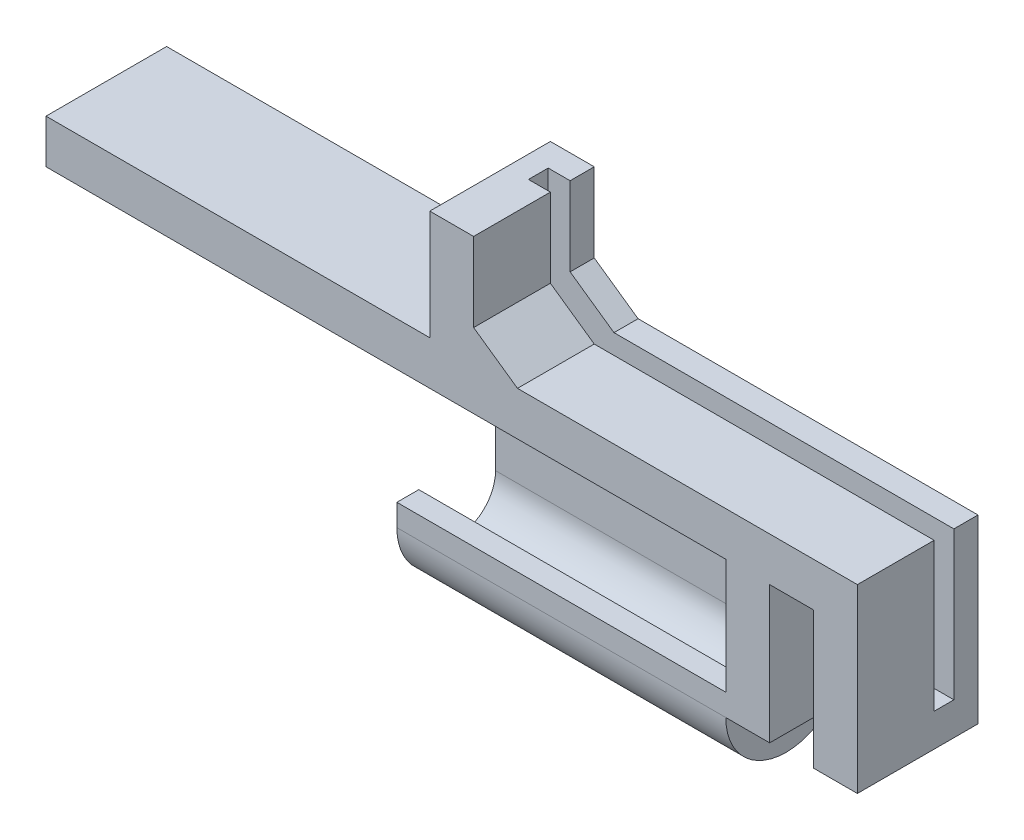
ISO-10303-21;
HEADER;
FILE_DESCRIPTION(('STEP AP214'),'2;1');
FILE_NAME('part.step','',(''),(''),'','','');
FILE_SCHEMA(('AUTOMOTIVE_DESIGN { 1 0 10303 214 1 1 1 1 }'));
ENDSEC;
DATA;
#1=APPLICATION_CONTEXT('core data for automotive mechanical design processes');
#2=APPLICATION_PROTOCOL_DEFINITION('international standard','automotive_design',2000,#1);
#3=PRODUCT_CONTEXT('',#1,'mechanical');
#4=PRODUCT('Part','Part','',(#3));
#5=PRODUCT_RELATED_PRODUCT_CATEGORY('part','',(#4));
#6=PRODUCT_DEFINITION_FORMATION('','',#4);
#7=PRODUCT_DEFINITION_CONTEXT('part definition',#1,'design');
#8=PRODUCT_DEFINITION('design','',#6,#7);
#9=PRODUCT_DEFINITION_SHAPE('','',#8);
#10=(LENGTH_UNIT() NAMED_UNIT(*) SI_UNIT(.MILLI.,.METRE.));
#11=(NAMED_UNIT(*) PLANE_ANGLE_UNIT() SI_UNIT($,.RADIAN.));
#12=(NAMED_UNIT(*) SI_UNIT($,.STERADIAN.) SOLID_ANGLE_UNIT());
#13=UNCERTAINTY_MEASURE_WITH_UNIT(LENGTH_MEASURE(1.E-05),#10,'distance_accuracy_value','');
#14=(GEOMETRIC_REPRESENTATION_CONTEXT(3) GLOBAL_UNCERTAINTY_ASSIGNED_CONTEXT((#13)) GLOBAL_UNIT_ASSIGNED_CONTEXT((#10,
#11,#12)) REPRESENTATION_CONTEXT('',''));
#15=CARTESIAN_POINT('',(0.,0.,0.));
#16=DIRECTION('',(0.,0.,1.));
#17=DIRECTION('',(1.,0.,0.));
#18=AXIS2_PLACEMENT_3D('',#15,#16,#17);
#19=CARTESIAN_POINT('',(37.,8.25,0.));
#20=DIRECTION('',(0.,-1.,0.));
#21=DIRECTION('',(0.,0.,-1.));
#22=AXIS2_PLACEMENT_3D('',#19,#20,#21);
#23=PLANE('',#22);
#24=DIRECTION('',(-1.,0.,0.));
#25=VECTOR('',#24,1.);
#26=CARTESIAN_POINT('',(37.,8.25,-5.5));
#27=LINE('',#26,#25);
#28=CARTESIAN_POINT('',(37.,8.25,-5.5));
#29=VERTEX_POINT('',#28);
#30=CARTESIAN_POINT('',(21.5,8.25,-5.5));
#31=VERTEX_POINT('',#30);
#32=EDGE_CURVE('E557',#29,#31,#27,.T.);
#33=ORIENTED_EDGE('',*,*,#32,.T.);
#34=DIRECTION('',(0.,0.,1.));
#35=VECTOR('',#34,1.);
#36=CARTESIAN_POINT('',(21.5,8.25,-4.4));
#37=LINE('',#36,#35);
#38=CARTESIAN_POINT('',(21.5,8.25,-4.4));
#39=VERTEX_POINT('',#38);
#40=EDGE_CURVE('E577',#31,#39,#37,.T.);
#41=ORIENTED_EDGE('',*,*,#40,.T.);
#42=DIRECTION('',(1.,0.,0.));
#43=VECTOR('',#42,1.);
#44=CARTESIAN_POINT('',(37.,8.25,-4.4));
#45=LINE('',#44,#43);
#46=CARTESIAN_POINT('',(37.,8.25,-4.4));
#47=VERTEX_POINT('',#46);
#48=EDGE_CURVE('E307',#39,#47,#45,.T.);
#49=ORIENTED_EDGE('',*,*,#48,.T.);
#50=DIRECTION('',(0.,0.,1.));
#51=VECTOR('',#50,1.);
#52=CARTESIAN_POINT('',(37.,8.25,0.));
#53=LINE('',#52,#51);
#54=EDGE_CURVE('E617',#29,#47,#53,.T.);
#55=ORIENTED_EDGE('',*,*,#54,.F.);
#56=EDGE_LOOP('',(#33,#41,#49,#55));
#57=FACE_BOUND('',#56,.T.);
#58=ADVANCED_FACE('F35',(#57),#23,.F.);
#59=CARTESIAN_POINT('',(37.,6.25,0.));
#60=DIRECTION('',(0.,1.,0.));
#61=DIRECTION('',(0.,0.,1.));
#62=AXIS2_PLACEMENT_3D('',#59,#60,#61);
#63=PLANE('',#62);
#64=DIRECTION('',(0.,0.,-1.));
#65=VECTOR('',#64,1.);
#66=CARTESIAN_POINT('',(35.,6.25,0.));
#67=LINE('',#66,#65);
#68=CARTESIAN_POINT('',(35.,6.25,-4.4));
#69=VERTEX_POINT('',#68);
#70=CARTESIAN_POINT('',(35.,6.25,-5.5));
#71=VERTEX_POINT('',#70);
#72=EDGE_CURVE('E380',#69,#71,#67,.T.);
#73=ORIENTED_EDGE('',*,*,#72,.F.);
#74=DIRECTION('',(-1.,0.,0.));
#75=VECTOR('',#74,1.);
#76=CARTESIAN_POINT('',(37.,6.25,-4.4));
#77=LINE('',#76,#75);
#78=CARTESIAN_POINT('',(33.,6.25,-4.4));
#79=VERTEX_POINT('',#78);
#80=EDGE_CURVE('E311',#69,#79,#77,.T.);
#81=ORIENTED_EDGE('',*,*,#80,.T.);
#82=DIRECTION('',(0.,0.,-1.));
#83=VECTOR('',#82,1.);
#84=CARTESIAN_POINT('',(33.,6.25,0.));
#85=LINE('',#84,#83);
#86=CARTESIAN_POINT('',(33.,6.25,-5.5));
#87=VERTEX_POINT('',#86);
#88=EDGE_CURVE('E454',#79,#87,#85,.T.);
#89=ORIENTED_EDGE('',*,*,#88,.T.);
#90=DIRECTION('',(-1.,0.,0.));
#91=VECTOR('',#90,1.);
#92=CARTESIAN_POINT('',(37.,6.25,-5.5));
#93=LINE('',#92,#91);
#94=EDGE_CURVE('E370',#71,#87,#93,.T.);
#95=ORIENTED_EDGE('',*,*,#94,.F.);
#96=EDGE_LOOP('',(#73,#81,#89,#95));
#97=FACE_BOUND('',#96,.T.);
#98=ADVANCED_FACE('F613',(#97),#63,.F.);
#99=CARTESIAN_POINT('',(19.5,13.25,0.));
#100=DIRECTION('',(-1.,0.,0.));
#101=DIRECTION('',(0.,0.,1.));
#102=AXIS2_PLACEMENT_3D('',#99,#100,#101);
#103=PLANE('',#102);
#104=DIRECTION('',(0.,-1.,0.));
#105=VECTOR('',#104,1.);
#106=CARTESIAN_POINT('',(19.5,13.25,-4.4));
#107=LINE('',#106,#105);
#108=CARTESIAN_POINT('',(19.5,13.25,-4.4));
#109=VERTEX_POINT('',#108);
#110=CARTESIAN_POINT('',(19.5,9.65041507641942,-4.4));
#111=VERTEX_POINT('',#110);
#112=EDGE_CURVE('E304',#109,#111,#107,.T.);
#113=ORIENTED_EDGE('',*,*,#112,.T.);
#114=DIRECTION('',(0.,0.,-1.));
#115=VECTOR('',#114,1.);
#116=CARTESIAN_POINT('',(19.5,9.65041507641942,-5.5));
#117=LINE('',#116,#115);
#118=CARTESIAN_POINT('',(19.5,9.65041507641942,-5.5));
#119=VERTEX_POINT('',#118);
#120=EDGE_CURVE('E581',#111,#119,#117,.T.);
#121=ORIENTED_EDGE('',*,*,#120,.T.);
#122=DIRECTION('',(0.,-1.,0.));
#123=VECTOR('',#122,1.);
#124=CARTESIAN_POINT('',(19.5,13.25,-5.5));
#125=LINE('',#124,#123);
#126=CARTESIAN_POINT('',(19.5,13.25,-5.5));
#127=VERTEX_POINT('',#126);
#128=EDGE_CURVE('E355',#127,#119,#125,.T.);
#129=ORIENTED_EDGE('',*,*,#128,.F.);
#130=DIRECTION('',(0.,0.,-1.));
#131=VECTOR('',#130,1.);
#132=CARTESIAN_POINT('',(19.5,13.25,0.));
#133=LINE('',#132,#131);
#134=EDGE_CURVE('E329',#109,#127,#133,.T.);
#135=ORIENTED_EDGE('',*,*,#134,.F.);
#136=EDGE_LOOP('',(#113,#121,#129,#135));
#137=FACE_BOUND('',#136,.T.);
#138=ADVANCED_FACE('F597',(#137),#103,.F.);
#139=DIRECTION('',(-1.,0.,0.));
#140=VECTOR('',#139,1.);
#141=CARTESIAN_POINT('',(37.,8.25,-3.5));
#142=LINE('',#141,#140);
#143=CARTESIAN_POINT('',(37.,8.25,-3.5));
#144=VERTEX_POINT('',#143);
#145=CARTESIAN_POINT('',(21.5,8.25,-3.5));
#146=VERTEX_POINT('',#145);
#147=EDGE_CURVE('E272',#144,#146,#142,.T.);
#148=ORIENTED_EDGE('',*,*,#147,.T.);
#149=DIRECTION('',(0.,0.,1.));
#150=VECTOR('',#149,1.);
#151=CARTESIAN_POINT('',(21.5,8.25,0.));
#152=LINE('',#151,#150);
#153=CARTESIAN_POINT('',(21.5,8.25,0.));
#154=VERTEX_POINT('',#153);
#155=EDGE_CURVE('E50',#146,#154,#152,.T.);
#156=ORIENTED_EDGE('',*,*,#155,.T.);
#157=DIRECTION('',(-1.,0.,0.));
#158=VECTOR('',#157,1.);
#159=CARTESIAN_POINT('',(37.,8.25,0.));
#160=LINE('',#159,#158);
#161=CARTESIAN_POINT('',(37.,8.25,0.));
#162=VERTEX_POINT('',#161);
#163=EDGE_CURVE('E562',#162,#154,#160,.T.);
#164=ORIENTED_EDGE('',*,*,#163,.F.);
#165=EDGE_CURVE('E620',#144,#162,#53,.T.);
#166=ORIENTED_EDGE('',*,*,#165,.F.);
#167=EDGE_LOOP('',(#148,#156,#164,#166));
#168=FACE_BOUND('',#167,.T.);
#169=ADVANCED_FACE('F669',(#168),#23,.F.);
#170=DIRECTION('',(0.,0.,1.));
#171=VECTOR('',#170,1.);
#172=CARTESIAN_POINT('',(17.5,8.25,-5.5));
#173=LINE('',#172,#171);
#174=CARTESIAN_POINT('',(17.5,8.25,-5.5));
#175=VERTEX_POINT('',#174);
#176=CARTESIAN_POINT('',(17.5,8.25,0.));
#177=VERTEX_POINT('',#176);
#178=EDGE_CURVE('E324',#175,#177,#173,.T.);
#179=ORIENTED_EDGE('',*,*,#178,.F.);
#180=CARTESIAN_POINT('',(0.,8.25,-5.5));
#181=VERTEX_POINT('',#180);
#182=EDGE_CURVE('E344',#175,#181,#27,.T.);
#183=ORIENTED_EDGE('',*,*,#182,.T.);
#184=DIRECTION('',(0.,0.,1.));
#185=VECTOR('',#184,1.);
#186=CARTESIAN_POINT('',(0.,8.25,0.));
#187=LINE('',#186,#185);
#188=CARTESIAN_POINT('',(0.,8.25,0.));
#189=VERTEX_POINT('',#188);
#190=EDGE_CURVE('E629',#181,#189,#187,.T.);
#191=ORIENTED_EDGE('',*,*,#190,.T.);
#192=EDGE_CURVE('E422',#177,#189,#160,.T.);
#193=ORIENTED_EDGE('',*,*,#192,.F.);
#194=EDGE_LOOP('',(#179,#183,#191,#193));
#195=FACE_BOUND('',#194,.T.);
#196=ADVANCED_FACE('F667',(#195),#23,.F.);
#197=CARTESIAN_POINT('',(31.,0.,0.));
#198=DIRECTION('',(1.,0.,0.));
#199=DIRECTION('',(0.,0.,-1.));
#200=AXIS2_PLACEMENT_3D('',#197,#198,#199);
#201=PLANE('',#200);
#202=DIRECTION('',(0.,0.,-1.));
#203=VECTOR('',#202,1.);
#204=CARTESIAN_POINT('',(31.,0.099584923580582,0.));
#205=LINE('',#204,#203);
#206=CARTESIAN_POINT('',(31.,0.099584923580582,-3.5));
#207=VERTEX_POINT('',#206);
#208=CARTESIAN_POINT('',(31.,0.099584923580582,-4.4));
#209=VERTEX_POINT('',#208);
#210=EDGE_CURVE('E379',#207,#209,#205,.T.);
#211=ORIENTED_EDGE('',*,*,#210,.T.);
#212=DIRECTION('',(0.,1.,0.));
#213=VECTOR('',#212,1.);
#214=CARTESIAN_POINT('',(31.,0.,-4.4));
#215=LINE('',#214,#213);
#216=CARTESIAN_POINT('',(31.,6.25,-4.4));
#217=VERTEX_POINT('',#216);
#218=EDGE_CURVE('E320',#209,#217,#215,.T.);
#219=ORIENTED_EDGE('',*,*,#218,.T.);
#220=DIRECTION('',(0.,0.,-1.));
#221=VECTOR('',#220,1.);
#222=CARTESIAN_POINT('',(31.,6.25,0.));
#223=LINE('',#222,#221);
#224=CARTESIAN_POINT('',(31.,6.25,-4.5));
#225=VERTEX_POINT('',#224);
#226=EDGE_CURVE('E446',#217,#225,#223,.T.);
#227=ORIENTED_EDGE('',*,*,#226,.T.);
#228=DIRECTION('',(0.,1.,0.));
#229=VECTOR('',#228,1.);
#230=CARTESIAN_POINT('',(31.,0.,-4.5));
#231=LINE('',#230,#229);
#232=CARTESIAN_POINT('',(31.,0.,-4.5));
#233=VERTEX_POINT('',#232);
#234=EDGE_CURVE('E338',#233,#225,#231,.T.);
#235=ORIENTED_EDGE('',*,*,#234,.F.);
#236=DIRECTION('',(0.,0.,-1.));
#237=VECTOR('',#236,1.);
#238=CARTESIAN_POINT('',(31.,0.,0.));
#239=LINE('',#238,#237);
#240=CARTESIAN_POINT('',(31.,0.,-1.));
#241=VERTEX_POINT('',#240);
#242=EDGE_CURVE('E439',#241,#233,#239,.T.);
#243=ORIENTED_EDGE('',*,*,#242,.F.);
#244=DIRECTION('',(0.,1.,0.));
#245=VECTOR('',#244,1.);
#246=CARTESIAN_POINT('',(31.,0.,-1.));
#247=LINE('',#246,#245);
#248=CARTESIAN_POINT('',(31.,1.,-1.));
#249=VERTEX_POINT('',#248);
#250=EDGE_CURVE('E501',#241,#249,#247,.T.);
#251=ORIENTED_EDGE('',*,*,#250,.T.);
#252=DIRECTION('',(0.,0.,1.));
#253=VECTOR('',#252,1.);
#254=CARTESIAN_POINT('',(31.,1.,0.));
#255=LINE('',#254,#253);
#256=CARTESIAN_POINT('',(31.,1.,0.));
#257=VERTEX_POINT('',#256);
#258=EDGE_CURVE('E498',#249,#257,#255,.T.);
#259=ORIENTED_EDGE('',*,*,#258,.T.);
#260=DIRECTION('',(0.,1.,0.));
#261=VECTOR('',#260,1.);
#262=CARTESIAN_POINT('',(31.,0.,0.));
#263=LINE('',#262,#261);
#264=CARTESIAN_POINT('',(31.,6.25,0.));
#265=VERTEX_POINT('',#264);
#266=EDGE_CURVE('E441',#257,#265,#263,.T.);
#267=ORIENTED_EDGE('',*,*,#266,.T.);
#268=CARTESIAN_POINT('',(31.,6.25,-3.5));
#269=VERTEX_POINT('',#268);
#270=EDGE_CURVE('E443',#265,#269,#223,.T.);
#271=ORIENTED_EDGE('',*,*,#270,.T.);
#272=DIRECTION('',(0.,-1.,0.));
#273=VECTOR('',#272,1.);
#274=CARTESIAN_POINT('',(31.,0.,-3.5));
#275=LINE('',#274,#273);
#276=EDGE_CURVE('E302',#269,#207,#275,.T.);
#277=ORIENTED_EDGE('',*,*,#276,.T.);
#278=EDGE_LOOP('',(#211,#219,#227,#235,#243,#251,#259,#267,#271,#277));
#279=FACE_BOUND('',#278,.T.);
#280=ADVANCED_FACE('F516',(#279),#201,.F.);
#281=ORIENTED_EDGE('',*,*,#226,.F.);
#282=DIRECTION('',(-1.,0.,0.));
#283=VECTOR('',#282,1.);
#284=CARTESIAN_POINT('',(37.,6.25,-4.4));
#285=LINE('',#284,#283);
#286=CARTESIAN_POINT('',(18.5,6.25,-4.4));
#287=VERTEX_POINT('',#286);
#288=EDGE_CURVE('E317',#217,#287,#285,.T.);
#289=ORIENTED_EDGE('',*,*,#288,.T.);
#290=DIRECTION('',(0.,0.,1.));
#291=VECTOR('',#290,1.);
#292=CARTESIAN_POINT('',(18.5,6.25,0.));
#293=LINE('',#292,#291);
#294=CARTESIAN_POINT('',(18.5,6.25,-3.5));
#295=VERTEX_POINT('',#294);
#296=EDGE_CURVE('E285',#287,#295,#293,.T.);
#297=ORIENTED_EDGE('',*,*,#296,.T.);
#298=DIRECTION('',(1.,0.,0.));
#299=VECTOR('',#298,1.);
#300=CARTESIAN_POINT('',(37.,6.25,-3.5));
#301=LINE('',#300,#299);
#302=EDGE_CURVE('E299',#295,#269,#301,.T.);
#303=ORIENTED_EDGE('',*,*,#302,.T.);
#304=ORIENTED_EDGE('',*,*,#270,.F.);
#305=DIRECTION('',(-1.,0.,0.));
#306=VECTOR('',#305,1.);
#307=CARTESIAN_POINT('',(37.,6.25,0.));
#308=LINE('',#307,#306);
#309=CARTESIAN_POINT('',(0.,6.25,0.));
#310=VERTEX_POINT('',#309);
#311=EDGE_CURVE('E405',#265,#310,#308,.T.);
#312=ORIENTED_EDGE('',*,*,#311,.T.);
#313=DIRECTION('',(0.,0.,-1.));
#314=VECTOR('',#313,1.);
#315=CARTESIAN_POINT('',(0.,6.25,0.));
#316=LINE('',#315,#314);
#317=CARTESIAN_POINT('',(0.,6.25,-5.5));
#318=VERTEX_POINT('',#317);
#319=EDGE_CURVE('E554',#310,#318,#316,.T.);
#320=ORIENTED_EDGE('',*,*,#319,.T.);
#321=CARTESIAN_POINT('',(16.,6.25,-5.5));
#322=VERTEX_POINT('',#321);
#323=EDGE_CURVE('E410',#322,#318,#93,.T.);
#324=ORIENTED_EDGE('',*,*,#323,.F.);
#325=DIRECTION('',(0.,0.,-1.));
#326=VECTOR('',#325,1.);
#327=CARTESIAN_POINT('',(16.,6.25,0.));
#328=LINE('',#327,#326);
#329=CARTESIAN_POINT('',(16.,6.25,-4.5));
#330=VERTEX_POINT('',#329);
#331=EDGE_CURVE('E474',#330,#322,#328,.T.);
#332=ORIENTED_EDGE('',*,*,#331,.F.);
#333=DIRECTION('',(-1.,0.,0.));
#334=VECTOR('',#333,1.);
#335=CARTESIAN_POINT('',(31.,6.25,-4.5));
#336=LINE('',#335,#334);
#337=EDGE_CURVE('E470',#225,#330,#336,.T.);
#338=ORIENTED_EDGE('',*,*,#337,.F.);
#339=EDGE_LOOP('',(#281,#289,#297,#303,#304,#312,#320,#324,#332,#338));
#340=FACE_BOUND('',#339,.T.);
#341=ADVANCED_FACE('F551',(#340),#63,.F.);
#342=CARTESIAN_POINT('',(33.,6.25,0.));
#343=VERTEX_POINT('',#342);
#344=CARTESIAN_POINT('',(33.,6.25,-3.5));
#345=VERTEX_POINT('',#344);
#346=EDGE_CURVE('E451',#343,#345,#85,.T.);
#347=ORIENTED_EDGE('',*,*,#346,.T.);
#348=DIRECTION('',(1.,0.,0.));
#349=VECTOR('',#348,1.);
#350=CARTESIAN_POINT('',(37.,6.25,-3.5));
#351=LINE('',#350,#349);
#352=CARTESIAN_POINT('',(35.,6.25,-3.5));
#353=VERTEX_POINT('',#352);
#354=EDGE_CURVE('E294',#345,#353,#351,.T.);
#355=ORIENTED_EDGE('',*,*,#354,.T.);
#356=CARTESIAN_POINT('',(35.,6.25,0.));
#357=VERTEX_POINT('',#356);
#358=EDGE_CURVE('E383',#357,#353,#67,.T.);
#359=ORIENTED_EDGE('',*,*,#358,.F.);
#360=EDGE_CURVE('E408',#357,#343,#308,.T.);
#361=ORIENTED_EDGE('',*,*,#360,.T.);
#362=EDGE_LOOP('',(#347,#355,#359,#361));
#363=FACE_BOUND('',#362,.T.);
#364=ADVANCED_FACE('F642',(#363),#63,.F.);
#365=CARTESIAN_POINT('',(37.,0.,-5.5));
#366=DIRECTION('',(0.,0.,-1.));
#367=DIRECTION('',(-1.,0.,0.));
#368=AXIS2_PLACEMENT_3D('',#365,#366,#367);
#369=PLANE('',#368);
#370=DIRECTION('',(0.,-1.,0.));
#371=VECTOR('',#370,1.);
#372=CARTESIAN_POINT('',(16.,0.,-5.5));
#373=LINE('',#372,#371);
#374=CARTESIAN_POINT('',(16.,0.,-5.5));
#375=VERTEX_POINT('',#374);
#376=EDGE_CURVE('E477',#322,#375,#373,.T.);
#377=ORIENTED_EDGE('',*,*,#376,.F.);
#378=ORIENTED_EDGE('',*,*,#323,.T.);
#379=DIRECTION('',(0.,-1.,0.));
#380=VECTOR('',#379,1.);
#381=CARTESIAN_POINT('',(0.,0.,-5.5));
#382=LINE('',#381,#380);
#383=EDGE_CURVE('E627',#181,#318,#382,.T.);
#384=ORIENTED_EDGE('',*,*,#383,.F.);
#385=ORIENTED_EDGE('',*,*,#182,.F.);
#386=DIRECTION('',(0.,-1.,0.));
#387=VECTOR('',#386,1.);
#388=CARTESIAN_POINT('',(17.5,13.25,-5.5));
#389=LINE('',#388,#387);
#390=CARTESIAN_POINT('',(17.5,13.25,-5.5));
#391=VERTEX_POINT('',#390);
#392=EDGE_CURVE('E350',#391,#175,#389,.T.);
#393=ORIENTED_EDGE('',*,*,#392,.F.);
#394=DIRECTION('',(-1.,0.,0.));
#395=VECTOR('',#394,1.);
#396=CARTESIAN_POINT('',(19.5,13.25,-5.5));
#397=LINE('',#396,#395);
#398=EDGE_CURVE('E328',#127,#391,#397,.T.);
#399=ORIENTED_EDGE('',*,*,#398,.F.);
#400=ORIENTED_EDGE('',*,*,#128,.T.);
#401=DIRECTION('',(-0.81915204428899,0.573576436351049,0.));
#402=VECTOR('',#401,1.);
#403=CARTESIAN_POINT('',(19.5,9.65041507641942,-5.5));
#404=LINE('',#403,#402);
#405=EDGE_CURVE('E579',#119,#31,#404,.F.);
#406=ORIENTED_EDGE('',*,*,#405,.T.);
#407=ORIENTED_EDGE('',*,*,#32,.F.);
#408=DIRECTION('',(0.,-1.,0.));
#409=VECTOR('',#408,1.);
#410=CARTESIAN_POINT('',(37.,0.,-5.5));
#411=LINE('',#410,#409);
#412=CARTESIAN_POINT('',(37.,0.,-5.5));
#413=VERTEX_POINT('',#412);
#414=EDGE_CURVE('E619',#29,#413,#411,.T.);
#415=ORIENTED_EDGE('',*,*,#414,.T.);
#416=DIRECTION('',(-1.,0.,0.));
#417=VECTOR('',#416,1.);
#418=CARTESIAN_POINT('',(37.,0.,-5.5));
#419=LINE('',#418,#417);
#420=CARTESIAN_POINT('',(35.,0.,-5.5));
#421=VERTEX_POINT('',#420);
#422=EDGE_CURVE('E636',#413,#421,#419,.T.);
#423=ORIENTED_EDGE('',*,*,#422,.T.);
#424=DIRECTION('',(0.,-1.,0.));
#425=VECTOR('',#424,1.);
#426=CARTESIAN_POINT('',(35.,0.,-5.5));
#427=LINE('',#426,#425);
#428=EDGE_CURVE('E384',#71,#421,#427,.T.);
#429=ORIENTED_EDGE('',*,*,#428,.F.);
#430=ORIENTED_EDGE('',*,*,#94,.T.);
#431=DIRECTION('',(0.,-1.,0.));
#432=VECTOR('',#431,1.);
#433=CARTESIAN_POINT('',(33.,0.,-5.5));
#434=LINE('',#433,#432);
#435=CARTESIAN_POINT('',(33.,0.,-5.5));
#436=VERTEX_POINT('',#435);
#437=EDGE_CURVE('E438',#87,#436,#434,.T.);
#438=ORIENTED_EDGE('',*,*,#437,.T.);
#439=DIRECTION('',(-1.,0.,0.));
#440=VECTOR('',#439,1.);
#441=CARTESIAN_POINT('',(33.,0.,-5.5));
#442=LINE('',#441,#440);
#443=CARTESIAN_POINT('',(31.,0.,-5.5));
#444=VERTEX_POINT('',#443);
#445=EDGE_CURVE('E428',#436,#444,#442,.T.);
#446=ORIENTED_EDGE('',*,*,#445,.T.);
#447=DIRECTION('',(-1.,0.,0.));
#448=VECTOR('',#447,1.);
#449=CARTESIAN_POINT('',(31.,0.,-5.5));
#450=LINE('',#449,#448);
#451=EDGE_CURVE('E468',#444,#375,#450,.T.);
#452=ORIENTED_EDGE('',*,*,#451,.T.);
#453=EDGE_LOOP('',(#377,#378,#384,#385,#393,#399,#400,#406,#407,#415,#423,#429,#430,#438,#446,#452));
#454=FACE_BOUND('',#453,.T.);
#455=ADVANCED_FACE('F532',(#454),#369,.T.);
#456=CARTESIAN_POINT('',(37.,0.,0.));
#457=DIRECTION('',(0.,0.,1.));
#458=DIRECTION('',(1.,0.,0.));
#459=AXIS2_PLACEMENT_3D('',#456,#457,#458);
#460=PLANE('',#459);
#461=DIRECTION('',(0.,1.,0.));
#462=VECTOR('',#461,1.);
#463=CARTESIAN_POINT('',(0.,0.,0.));
#464=LINE('',#463,#462);
#465=EDGE_CURVE('E416',#310,#189,#464,.T.);
#466=ORIENTED_EDGE('',*,*,#465,.F.);
#467=ORIENTED_EDGE('',*,*,#311,.F.);
#468=ORIENTED_EDGE('',*,*,#266,.F.);
#469=DIRECTION('',(-1.,0.,0.));
#470=VECTOR('',#469,1.);
#471=CARTESIAN_POINT('',(31.,1.,0.));
#472=LINE('',#471,#470);
#473=CARTESIAN_POINT('',(16.,1.,0.));
#474=VERTEX_POINT('',#473);
#475=EDGE_CURVE('E464',#257,#474,#472,.T.);
#476=ORIENTED_EDGE('',*,*,#475,.T.);
#477=DIRECTION('',(0.,1.,0.));
#478=VECTOR('',#477,1.);
#479=CARTESIAN_POINT('',(16.,0.,0.));
#480=LINE('',#479,#478);
#481=CARTESIAN_POINT('',(16.,0.,0.));
#482=VERTEX_POINT('',#481);
#483=EDGE_CURVE('E483',#482,#474,#480,.T.);
#484=ORIENTED_EDGE('',*,*,#483,.F.);
#485=DIRECTION('',(-1.,0.,0.));
#486=VECTOR('',#485,1.);
#487=CARTESIAN_POINT('',(31.,0.,0.));
#488=LINE('',#487,#486);
#489=CARTESIAN_POINT('',(31.,0.,0.));
#490=VERTEX_POINT('',#489);
#491=EDGE_CURVE('E466',#490,#482,#488,.T.);
#492=ORIENTED_EDGE('',*,*,#491,.F.);
#493=DIRECTION('',(-1.,0.,0.));
#494=VECTOR('',#493,1.);
#495=CARTESIAN_POINT('',(33.,0.,0.));
#496=LINE('',#495,#494);
#497=CARTESIAN_POINT('',(33.,0.,0.));
#498=VERTEX_POINT('',#497);
#499=EDGE_CURVE('E424',#498,#490,#496,.T.);
#500=ORIENTED_EDGE('',*,*,#499,.F.);
#501=DIRECTION('',(0.,1.,0.));
#502=VECTOR('',#501,1.);
#503=CARTESIAN_POINT('',(33.,0.,0.));
#504=LINE('',#503,#502);
#505=EDGE_CURVE('E448',#498,#343,#504,.T.);
#506=ORIENTED_EDGE('',*,*,#505,.T.);
#507=ORIENTED_EDGE('',*,*,#360,.F.);
#508=DIRECTION('',(0.,1.,0.));
#509=VECTOR('',#508,1.);
#510=CARTESIAN_POINT('',(35.,0.,0.));
#511=LINE('',#510,#509);
#512=CARTESIAN_POINT('',(35.,0.,0.));
#513=VERTEX_POINT('',#512);
#514=EDGE_CURVE('E398',#513,#357,#511,.T.);
#515=ORIENTED_EDGE('',*,*,#514,.F.);
#516=DIRECTION('',(-1.,0.,0.));
#517=VECTOR('',#516,1.);
#518=CARTESIAN_POINT('',(37.,0.,0.));
#519=LINE('',#518,#517);
#520=CARTESIAN_POINT('',(37.,0.,0.));
#521=VERTEX_POINT('',#520);
#522=EDGE_CURVE('E628',#521,#513,#519,.T.);
#523=ORIENTED_EDGE('',*,*,#522,.F.);
#524=DIRECTION('',(0.,1.,0.));
#525=VECTOR('',#524,1.);
#526=CARTESIAN_POINT('',(37.,0.,0.));
#527=LINE('',#526,#525);
#528=EDGE_CURVE('E409',#521,#162,#527,.T.);
#529=ORIENTED_EDGE('',*,*,#528,.T.);
#530=ORIENTED_EDGE('',*,*,#163,.T.);
#531=DIRECTION('',(0.81915204428899,-0.573576436351049,0.));
#532=VECTOR('',#531,1.);
#533=CARTESIAN_POINT('',(19.5,9.65041507641942,0.));
#534=LINE('',#533,#532);
#535=CARTESIAN_POINT('',(19.5,9.65041507641942,0.));
#536=VERTEX_POINT('',#535);
#537=EDGE_CURVE('E11',#154,#536,#534,.F.);
#538=ORIENTED_EDGE('',*,*,#537,.T.);
#539=DIRECTION('',(0.,-1.,0.));
#540=VECTOR('',#539,1.);
#541=CARTESIAN_POINT('',(19.5,13.25,0.));
#542=LINE('',#541,#540);
#543=CARTESIAN_POINT('',(19.5,13.25,0.));
#544=VERTEX_POINT('',#543);
#545=EDGE_CURVE('E335',#544,#536,#542,.T.);
#546=ORIENTED_EDGE('',*,*,#545,.F.);
#547=DIRECTION('',(1.,0.,0.));
#548=VECTOR('',#547,1.);
#549=CARTESIAN_POINT('',(17.5,13.25,0.));
#550=LINE('',#549,#548);
#551=CARTESIAN_POINT('',(17.5,13.25,0.));
#552=VERTEX_POINT('',#551);
#553=EDGE_CURVE('E333',#552,#544,#550,.T.);
#554=ORIENTED_EDGE('',*,*,#553,.F.);
#555=DIRECTION('',(0.,-1.,0.));
#556=VECTOR('',#555,1.);
#557=CARTESIAN_POINT('',(17.5,13.25,0.));
#558=LINE('',#557,#556);
#559=EDGE_CURVE('E347',#552,#177,#558,.T.);
#560=ORIENTED_EDGE('',*,*,#559,.T.);
#561=ORIENTED_EDGE('',*,*,#192,.T.);
#562=EDGE_LOOP('',(#466,#467,#468,#476,#484,#492,#500,#506,#507,#515,#523,#529,#530,#538,#546,
#554,#560,#561));
#563=FACE_BOUND('',#562,.T.);
#564=ADVANCED_FACE('F544',(#563),#460,.T.);
#565=CARTESIAN_POINT('',(37.,0.,0.));
#566=DIRECTION('',(1.,0.,0.));
#567=DIRECTION('',(0.,0.,-1.));
#568=AXIS2_PLACEMENT_3D('',#565,#566,#567);
#569=PLANE('',#568);
#570=DIRECTION('',(0.,1.,0.));
#571=VECTOR('',#570,1.);
#572=CARTESIAN_POINT('',(37.,13.6599900015905,-4.4));
#573=LINE('',#572,#571);
#574=CARTESIAN_POINT('',(37.,1.5,-4.4));
#575=VERTEX_POINT('',#574);
#576=EDGE_CURVE('E279',#575,#47,#573,.T.);
#577=ORIENTED_EDGE('',*,*,#576,.F.);
#578=DIRECTION('',(0.,0.,-1.));
#579=VECTOR('',#578,1.);
#580=CARTESIAN_POINT('',(37.,1.5,-4.4));
#581=LINE('',#580,#579);
#582=CARTESIAN_POINT('',(37.,1.5,-3.5));
#583=VERTEX_POINT('',#582);
#584=EDGE_CURVE('E260',#583,#575,#581,.T.);
#585=ORIENTED_EDGE('',*,*,#584,.F.);
#586=DIRECTION('',(0.,-1.,0.));
#587=VECTOR('',#586,1.);
#588=CARTESIAN_POINT('',(37.,1.5,-3.5));
#589=LINE('',#588,#587);
#590=EDGE_CURVE('E269',#144,#583,#589,.T.);
#591=ORIENTED_EDGE('',*,*,#590,.F.);
#592=ORIENTED_EDGE('',*,*,#165,.T.);
#593=ORIENTED_EDGE('',*,*,#528,.F.);
#594=DIRECTION('',(0.,0.,-1.));
#595=VECTOR('',#594,1.);
#596=CARTESIAN_POINT('',(37.,0.,0.));
#597=LINE('',#596,#595);
#598=EDGE_CURVE('E389',#521,#413,#597,.T.);
#599=ORIENTED_EDGE('',*,*,#598,.T.);
#600=ORIENTED_EDGE('',*,*,#414,.F.);
#601=ORIENTED_EDGE('',*,*,#54,.T.);
#602=EDGE_LOOP('',(#577,#585,#591,#592,#593,#599,#600,#601));
#603=FACE_BOUND('',#602,.T.);
#604=ADVANCED_FACE('F276',(#603),#569,.T.);
#605=CARTESIAN_POINT('',(0.,0.,0.));
#606=DIRECTION('',(1.,0.,0.));
#607=DIRECTION('',(0.,0.,-1.));
#608=AXIS2_PLACEMENT_3D('',#605,#606,#607);
#609=PLANE('',#608);
#610=ORIENTED_EDGE('',*,*,#319,.F.);
#611=ORIENTED_EDGE('',*,*,#465,.T.);
#612=ORIENTED_EDGE('',*,*,#190,.F.);
#613=ORIENTED_EDGE('',*,*,#383,.T.);
#614=EDGE_LOOP('',(#610,#611,#612,#613));
#615=FACE_BOUND('',#614,.T.);
#616=ADVANCED_FACE('F648',(#615),#609,.F.);
#617=CARTESIAN_POINT('',(37.,0.,0.));
#618=DIRECTION('',(0.,1.,0.));
#619=DIRECTION('',(0.,0.,1.));
#620=AXIS2_PLACEMENT_3D('',#617,#618,#619);
#621=PLANE('',#620);
#622=DIRECTION('',(0.,0.,-1.));
#623=VECTOR('',#622,1.);
#624=CARTESIAN_POINT('',(35.,0.,0.));
#625=LINE('',#624,#623);
#626=EDGE_CURVE('E391',#513,#421,#625,.T.);
#627=ORIENTED_EDGE('',*,*,#626,.T.);
#628=ORIENTED_EDGE('',*,*,#422,.F.);
#629=ORIENTED_EDGE('',*,*,#598,.F.);
#630=ORIENTED_EDGE('',*,*,#522,.T.);
#631=EDGE_LOOP('',(#627,#628,#629,#630));
#632=FACE_BOUND('',#631,.T.);
#633=ADVANCED_FACE('F640',(#632),#621,.F.);
#634=CARTESIAN_POINT('',(35.,0.,0.));
#635=DIRECTION('',(1.,0.,0.));
#636=DIRECTION('',(0.,0.,-1.));
#637=AXIS2_PLACEMENT_3D('',#634,#635,#636);
#638=PLANE('',#637);
#639=DIRECTION('',(0.,0.,-1.));
#640=VECTOR('',#639,1.);
#641=CARTESIAN_POINT('',(35.,1.5,0.));
#642=LINE('',#641,#640);
#643=CARTESIAN_POINT('',(35.,1.5,-3.5));
#644=VERTEX_POINT('',#643);
#645=CARTESIAN_POINT('',(35.,1.5,-4.4));
#646=VERTEX_POINT('',#645);
#647=EDGE_CURVE('E263',#644,#646,#642,.T.);
#648=ORIENTED_EDGE('',*,*,#647,.T.);
#649=DIRECTION('',(0.,1.,0.));
#650=VECTOR('',#649,1.);
#651=CARTESIAN_POINT('',(35.,0.,-4.4));
#652=LINE('',#651,#650);
#653=EDGE_CURVE('E314',#646,#69,#652,.T.);
#654=ORIENTED_EDGE('',*,*,#653,.T.);
#655=ORIENTED_EDGE('',*,*,#72,.T.);
#656=ORIENTED_EDGE('',*,*,#428,.T.);
#657=ORIENTED_EDGE('',*,*,#626,.F.);
#658=ORIENTED_EDGE('',*,*,#514,.T.);
#659=ORIENTED_EDGE('',*,*,#358,.T.);
#660=DIRECTION('',(0.,-1.,0.));
#661=VECTOR('',#660,1.);
#662=CARTESIAN_POINT('',(35.,0.,-3.5));
#663=LINE('',#662,#661);
#664=EDGE_CURVE('E297',#353,#644,#663,.T.);
#665=ORIENTED_EDGE('',*,*,#664,.T.);
#666=EDGE_LOOP('',(#648,#654,#655,#656,#657,#658,#659,#665));
#667=FACE_BOUND('',#666,.T.);
#668=ADVANCED_FACE('F615',(#667),#638,.F.);
#669=CARTESIAN_POINT('',(33.,0.,0.));
#670=DIRECTION('',(0.,1.,0.));
#671=DIRECTION('',(0.,0.,1.));
#672=AXIS2_PLACEMENT_3D('',#669,#670,#671);
#673=PLANE('',#672);
#674=EDGE_CURVE('E436',#490,#241,#239,.T.);
#675=ORIENTED_EDGE('',*,*,#674,.T.);
#676=ORIENTED_EDGE('',*,*,#242,.T.);
#677=EDGE_CURVE('E440',#233,#444,#239,.T.);
#678=ORIENTED_EDGE('',*,*,#677,.T.);
#679=ORIENTED_EDGE('',*,*,#445,.F.);
#680=DIRECTION('',(0.,0.,-1.));
#681=VECTOR('',#680,1.);
#682=CARTESIAN_POINT('',(33.,0.,0.));
#683=LINE('',#682,#681);
#684=EDGE_CURVE('E433',#498,#436,#683,.T.);
#685=ORIENTED_EDGE('',*,*,#684,.F.);
#686=ORIENTED_EDGE('',*,*,#499,.T.);
#687=EDGE_LOOP('',(#675,#676,#678,#679,#685,#686));
#688=FACE_BOUND('',#687,.T.);
#689=ADVANCED_FACE('F520',(#688),#673,.F.);
#690=CARTESIAN_POINT('',(33.,0.,0.));
#691=DIRECTION('',(1.,0.,0.));
#692=DIRECTION('',(0.,0.,-1.));
#693=AXIS2_PLACEMENT_3D('',#690,#691,#692);
#694=PLANE('',#693);
#695=DIRECTION('',(0.,1.,0.));
#696=VECTOR('',#695,1.);
#697=CARTESIAN_POINT('',(33.,0.,-4.4));
#698=LINE('',#697,#696);
#699=CARTESIAN_POINT('',(33.,1.5,-4.4));
#700=VERTEX_POINT('',#699);
#701=EDGE_CURVE('E309',#700,#79,#698,.T.);
#702=ORIENTED_EDGE('',*,*,#701,.F.);
#703=DIRECTION('',(0.,0.,-1.));
#704=VECTOR('',#703,1.);
#705=CARTESIAN_POINT('',(33.,1.5,0.));
#706=LINE('',#705,#704);
#707=CARTESIAN_POINT('',(33.,1.5,-3.5));
#708=VERTEX_POINT('',#707);
#709=EDGE_CURVE('E376',#708,#700,#706,.T.);
#710=ORIENTED_EDGE('',*,*,#709,.F.);
#711=DIRECTION('',(0.,-1.,0.));
#712=VECTOR('',#711,1.);
#713=CARTESIAN_POINT('',(33.,0.,-3.5));
#714=LINE('',#713,#712);
#715=EDGE_CURVE('E292',#345,#708,#714,.T.);
#716=ORIENTED_EDGE('',*,*,#715,.F.);
#717=ORIENTED_EDGE('',*,*,#346,.F.);
#718=ORIENTED_EDGE('',*,*,#505,.F.);
#719=ORIENTED_EDGE('',*,*,#684,.T.);
#720=ORIENTED_EDGE('',*,*,#437,.F.);
#721=ORIENTED_EDGE('',*,*,#88,.F.);
#722=EDGE_LOOP('',(#702,#710,#716,#717,#718,#719,#720,#721));
#723=FACE_BOUND('',#722,.T.);
#724=ADVANCED_FACE('F539',(#723),#694,.T.);
#725=CARTESIAN_POINT('',(31.,0.,0.));
#726=DIRECTION('',(1.,0.,0.));
#727=DIRECTION('',(0.,0.,-1.));
#728=AXIS2_PLACEMENT_3D('',#725,#726,#727);
#729=PLANE('',#728);
#730=ORIENTED_EDGE('',*,*,#674,.F.);
#731=CARTESIAN_POINT('',(31.,0.,-2.75));
#732=DIRECTION('',(1.,0.,0.));
#733=DIRECTION('',(0.,0.,-1.));
#734=AXIS2_PLACEMENT_3D('',#731,#732,#733);
#735=CIRCLE('',#734,2.75);
#736=EDGE_CURVE('E473',#490,#444,#735,.T.);
#737=ORIENTED_EDGE('',*,*,#736,.T.);
#738=ORIENTED_EDGE('',*,*,#677,.F.);
#739=CARTESIAN_POINT('',(31.,0.,-2.75));
#740=DIRECTION('',(1.,0.,0.));
#741=DIRECTION('',(0.,0.,-1.));
#742=AXIS2_PLACEMENT_3D('',#739,#740,#741);
#743=CIRCLE('',#742,1.75);
#744=EDGE_CURVE('E502',#241,#233,#743,.T.);
#745=ORIENTED_EDGE('',*,*,#744,.F.);
#746=EDGE_LOOP('',(#730,#737,#738,#745));
#747=FACE_BOUND('',#746,.T.);
#748=ADVANCED_FACE('F523',(#747),#729,.T.);
#749=CARTESIAN_POINT('',(31.,0.,-4.5));
#750=DIRECTION('',(0.,0.,1.));
#751=DIRECTION('',(1.,0.,0.));
#752=AXIS2_PLACEMENT_3D('',#749,#750,#751);
#753=PLANE('',#752);
#754=DIRECTION('',(0.,1.,0.));
#755=VECTOR('',#754,1.);
#756=CARTESIAN_POINT('',(16.,0.,-4.5));
#757=LINE('',#756,#755);
#758=CARTESIAN_POINT('',(16.,0.,-4.5));
#759=VERTEX_POINT('',#758);
#760=EDGE_CURVE('E360',#759,#330,#757,.T.);
#761=ORIENTED_EDGE('',*,*,#760,.F.);
#762=DIRECTION('',(-1.,0.,0.));
#763=VECTOR('',#762,1.);
#764=CARTESIAN_POINT('',(31.,0.,-4.5));
#765=LINE('',#764,#763);
#766=EDGE_CURVE('E457',#233,#759,#765,.T.);
#767=ORIENTED_EDGE('',*,*,#766,.F.);
#768=ORIENTED_EDGE('',*,*,#234,.T.);
#769=ORIENTED_EDGE('',*,*,#337,.T.);
#770=EDGE_LOOP('',(#761,#767,#768,#769));
#771=FACE_BOUND('',#770,.T.);
#772=ADVANCED_FACE('F511',(#771),#753,.T.);
#773=CARTESIAN_POINT('',(31.,0.,-2.75));
#774=DIRECTION('',(-1.,0.,0.));
#775=DIRECTION('',(0.,0.,1.));
#776=AXIS2_PLACEMENT_3D('',#773,#774,#775);
#777=CYLINDRICAL_SURFACE('',#776,1.75);
#778=CARTESIAN_POINT('',(16.,0.,-2.75));
#779=DIRECTION('',(1.,0.,0.));
#780=DIRECTION('',(0.,0.,-1.));
#781=AXIS2_PLACEMENT_3D('',#778,#779,#780);
#782=CIRCLE('',#781,1.75);
#783=CARTESIAN_POINT('',(16.,0.,-1.));
#784=VERTEX_POINT('',#783);
#785=EDGE_CURVE('E491',#784,#759,#782,.T.);
#786=ORIENTED_EDGE('',*,*,#785,.F.);
#787=DIRECTION('',(-1.,0.,0.));
#788=VECTOR('',#787,1.);
#789=CARTESIAN_POINT('',(31.,0.,-1.));
#790=LINE('',#789,#788);
#791=EDGE_CURVE('E459',#241,#784,#790,.T.);
#792=ORIENTED_EDGE('',*,*,#791,.F.);
#793=ORIENTED_EDGE('',*,*,#744,.T.);
#794=ORIENTED_EDGE('',*,*,#766,.T.);
#795=EDGE_LOOP('',(#786,#792,#793,#794));
#796=FACE_BOUND('',#795,.T.);
#797=ADVANCED_FACE('F713',(#796),#777,.F.);
#798=CARTESIAN_POINT('',(31.,0.,-1.));
#799=DIRECTION('',(0.,0.,1.));
#800=DIRECTION('',(1.,0.,0.));
#801=AXIS2_PLACEMENT_3D('',#798,#799,#800);
#802=PLANE('',#801);
#803=DIRECTION('',(0.,1.,0.));
#804=VECTOR('',#803,1.);
#805=CARTESIAN_POINT('',(16.,0.,-1.));
#806=LINE('',#805,#804);
#807=CARTESIAN_POINT('',(16.,1.,-1.));
#808=VERTEX_POINT('',#807);
#809=EDGE_CURVE('E489',#784,#808,#806,.T.);
#810=ORIENTED_EDGE('',*,*,#809,.T.);
#811=DIRECTION('',(-1.,0.,0.));
#812=VECTOR('',#811,1.);
#813=CARTESIAN_POINT('',(31.,1.,-1.));
#814=LINE('',#813,#812);
#815=EDGE_CURVE('E461',#249,#808,#814,.T.);
#816=ORIENTED_EDGE('',*,*,#815,.F.);
#817=ORIENTED_EDGE('',*,*,#250,.F.);
#818=ORIENTED_EDGE('',*,*,#791,.T.);
#819=EDGE_LOOP('',(#810,#816,#817,#818));
#820=FACE_BOUND('',#819,.T.);
#821=ADVANCED_FACE('F716',(#820),#802,.F.);
#822=CARTESIAN_POINT('',(31.,1.,0.));
#823=DIRECTION('',(0.,-1.,0.));
#824=DIRECTION('',(0.,0.,-1.));
#825=AXIS2_PLACEMENT_3D('',#822,#823,#824);
#826=PLANE('',#825);
#827=DIRECTION('',(0.,0.,1.));
#828=VECTOR('',#827,1.);
#829=CARTESIAN_POINT('',(16.,1.,0.));
#830=LINE('',#829,#828);
#831=EDGE_CURVE('E486',#808,#474,#830,.T.);
#832=ORIENTED_EDGE('',*,*,#831,.T.);
#833=ORIENTED_EDGE('',*,*,#475,.F.);
#834=ORIENTED_EDGE('',*,*,#258,.F.);
#835=ORIENTED_EDGE('',*,*,#815,.T.);
#836=EDGE_LOOP('',(#832,#833,#834,#835));
#837=FACE_BOUND('',#836,.T.);
#838=ADVANCED_FACE('F719',(#837),#826,.F.);
#839=CARTESIAN_POINT('',(31.,0.,-2.75));
#840=DIRECTION('',(-1.,0.,0.));
#841=DIRECTION('',(0.,0.,1.));
#842=AXIS2_PLACEMENT_3D('',#839,#840,#841);
#843=CYLINDRICAL_SURFACE('',#842,2.75);
#844=CARTESIAN_POINT('',(16.,0.,-2.75));
#845=DIRECTION('',(1.,0.,0.));
#846=DIRECTION('',(0.,0.,-1.));
#847=AXIS2_PLACEMENT_3D('',#844,#845,#846);
#848=CIRCLE('',#847,2.75);
#849=EDGE_CURVE('E480',#482,#375,#848,.T.);
#850=ORIENTED_EDGE('',*,*,#849,.T.);
#851=ORIENTED_EDGE('',*,*,#451,.F.);
#852=ORIENTED_EDGE('',*,*,#736,.F.);
#853=ORIENTED_EDGE('',*,*,#491,.T.);
#854=EDGE_LOOP('',(#850,#851,#852,#853));
#855=FACE_BOUND('',#854,.T.);
#856=ADVANCED_FACE('F528',(#855),#843,.T.);
#857=CARTESIAN_POINT('',(16.,0.,0.));
#858=DIRECTION('',(1.,0.,0.));
#859=DIRECTION('',(0.,0.,-1.));
#860=AXIS2_PLACEMENT_3D('',#857,#858,#859);
#861=PLANE('',#860);
#862=ORIENTED_EDGE('',*,*,#760,.T.);
#863=ORIENTED_EDGE('',*,*,#331,.T.);
#864=ORIENTED_EDGE('',*,*,#376,.T.);
#865=ORIENTED_EDGE('',*,*,#849,.F.);
#866=ORIENTED_EDGE('',*,*,#483,.T.);
#867=ORIENTED_EDGE('',*,*,#831,.F.);
#868=ORIENTED_EDGE('',*,*,#809,.F.);
#869=ORIENTED_EDGE('',*,*,#785,.T.);
#870=EDGE_LOOP('',(#862,#863,#864,#865,#866,#867,#868,#869));
#871=FACE_BOUND('',#870,.T.);
#872=ADVANCED_FACE('F548',(#871),#861,.F.);
#873=ORIENTED_EDGE('',*,*,#545,.T.);
#874=DIRECTION('',(0.,0.,-1.));
#875=VECTOR('',#874,1.);
#876=CARTESIAN_POINT('',(19.5,9.65041507641942,-3.5));
#877=LINE('',#876,#875);
#878=CARTESIAN_POINT('',(19.5,9.65041507641942,-3.5));
#879=VERTEX_POINT('',#878);
#880=EDGE_CURVE('E575',#536,#879,#877,.T.);
#881=ORIENTED_EDGE('',*,*,#880,.T.);
#882=DIRECTION('',(0.,1.,0.));
#883=VECTOR('',#882,1.);
#884=CARTESIAN_POINT('',(19.5,13.25,-3.5));
#885=LINE('',#884,#883);
#886=CARTESIAN_POINT('',(19.5,13.25,-3.5));
#887=VERTEX_POINT('',#886);
#888=EDGE_CURVE('E289',#879,#887,#885,.T.);
#889=ORIENTED_EDGE('',*,*,#888,.T.);
#890=EDGE_CURVE('E325',#544,#887,#133,.T.);
#891=ORIENTED_EDGE('',*,*,#890,.F.);
#892=EDGE_LOOP('',(#873,#881,#889,#891));
#893=FACE_BOUND('',#892,.T.);
#894=ADVANCED_FACE('F666',(#893),#103,.F.);
#895=CARTESIAN_POINT('',(17.5,13.25,-5.5));
#896=DIRECTION('',(1.,0.,0.));
#897=DIRECTION('',(0.,0.,-1.));
#898=AXIS2_PLACEMENT_3D('',#895,#896,#897);
#899=PLANE('',#898);
#900=ORIENTED_EDGE('',*,*,#178,.T.);
#901=ORIENTED_EDGE('',*,*,#559,.F.);
#902=DIRECTION('',(0.,0.,1.));
#903=VECTOR('',#902,1.);
#904=CARTESIAN_POINT('',(17.5,13.25,-5.5));
#905=LINE('',#904,#903);
#906=EDGE_CURVE('E331',#391,#552,#905,.T.);
#907=ORIENTED_EDGE('',*,*,#906,.F.);
#908=ORIENTED_EDGE('',*,*,#392,.T.);
#909=EDGE_LOOP('',(#900,#901,#907,#908));
#910=FACE_BOUND('',#909,.T.);
#911=ADVANCED_FACE('F654',(#910),#899,.F.);
#912=CARTESIAN_POINT('',(0.,13.25,0.));
#913=DIRECTION('',(0.,1.,0.));
#914=DIRECTION('',(0.,0.,1.));
#915=AXIS2_PLACEMENT_3D('',#912,#913,#914);
#916=PLANE('',#915);
#917=DIRECTION('',(-1.,0.,0.));
#918=VECTOR('',#917,1.);
#919=CARTESIAN_POINT('',(0.,13.25,-4.4));
#920=LINE('',#919,#918);
#921=CARTESIAN_POINT('',(18.5,13.25,-4.4));
#922=VERTEX_POINT('',#921);
#923=EDGE_CURVE('E373',#109,#922,#920,.T.);
#924=ORIENTED_EDGE('',*,*,#923,.F.);
#925=ORIENTED_EDGE('',*,*,#134,.T.);
#926=ORIENTED_EDGE('',*,*,#398,.T.);
#927=ORIENTED_EDGE('',*,*,#906,.T.);
#928=ORIENTED_EDGE('',*,*,#553,.T.);
#929=ORIENTED_EDGE('',*,*,#890,.T.);
#930=DIRECTION('',(1.,0.,0.));
#931=VECTOR('',#930,1.);
#932=CARTESIAN_POINT('',(0.,13.25,-3.5));
#933=LINE('',#932,#931);
#934=CARTESIAN_POINT('',(18.5,13.25,-3.5));
#935=VERTEX_POINT('',#934);
#936=EDGE_CURVE('E369',#935,#887,#933,.T.);
#937=ORIENTED_EDGE('',*,*,#936,.F.);
#938=DIRECTION('',(0.,0.,1.));
#939=VECTOR('',#938,1.);
#940=CARTESIAN_POINT('',(18.5,13.25,0.));
#941=LINE('',#940,#939);
#942=EDGE_CURVE('E367',#922,#935,#941,.T.);
#943=ORIENTED_EDGE('',*,*,#942,.F.);
#944=EDGE_LOOP('',(#924,#925,#926,#927,#928,#929,#937,#943));
#945=FACE_BOUND('',#944,.T.);
#946=ADVANCED_FACE('F658',(#945),#916,.T.);
#947=CARTESIAN_POINT('',(18.5,1.5,-4.4));
#948=DIRECTION('',(0.,-1.,0.));
#949=DIRECTION('',(0.,0.,-1.));
#950=AXIS2_PLACEMENT_3D('',#947,#948,#949);
#951=PLANE('',#950);
#952=DIRECTION('',(1.,0.,0.));
#953=VECTOR('',#952,1.);
#954=CARTESIAN_POINT('',(18.5,1.5,-3.5));
#955=LINE('',#954,#953);
#956=EDGE_CURVE('E255',#644,#583,#955,.T.);
#957=ORIENTED_EDGE('',*,*,#956,.T.);
#958=ORIENTED_EDGE('',*,*,#584,.T.);
#959=DIRECTION('',(1.,0.,0.));
#960=VECTOR('',#959,1.);
#961=CARTESIAN_POINT('',(18.5,1.5,-4.4));
#962=LINE('',#961,#960);
#963=EDGE_CURVE('E265',#646,#575,#962,.T.);
#964=ORIENTED_EDGE('',*,*,#963,.F.);
#965=ORIENTED_EDGE('',*,*,#647,.F.);
#966=EDGE_LOOP('',(#957,#958,#964,#965));
#967=FACE_BOUND('',#966,.T.);
#968=ADVANCED_FACE('F257',(#967),#951,.F.);
#969=CARTESIAN_POINT('',(18.5,13.6599900015905,-4.4));
#970=DIRECTION('',(0.,0.,-1.));
#971=DIRECTION('',(0.,1.,0.));
#972=AXIS2_PLACEMENT_3D('',#969,#970,#971);
#973=PLANE('',#972);
#974=ORIENTED_EDGE('',*,*,#218,.F.);
#975=DIRECTION('',(-0.819152044288993,-0.573576436351044,0.));
#976=VECTOR('',#975,1.);
#977=CARTESIAN_POINT('',(28.9836803975514,-1.31225726149393,-4.4));
#978=LINE('',#977,#976);
#979=EDGE_CURVE('E602',#209,#700,#978,.F.);
#980=ORIENTED_EDGE('',*,*,#979,.T.);
#981=ORIENTED_EDGE('',*,*,#701,.T.);
#982=ORIENTED_EDGE('',*,*,#80,.F.);
#983=ORIENTED_EDGE('',*,*,#653,.F.);
#984=ORIENTED_EDGE('',*,*,#963,.T.);
#985=ORIENTED_EDGE('',*,*,#576,.T.);
#986=ORIENTED_EDGE('',*,*,#48,.F.);
#987=DIRECTION('',(0.81915204428899,-0.573576436351049,0.));
#988=VECTOR('',#987,1.);
#989=CARTESIAN_POINT('',(16.9451059435014,11.4393711541069,-4.4));
#990=LINE('',#989,#988);
#991=EDGE_CURVE('E586',#39,#111,#990,.F.);
#992=ORIENTED_EDGE('',*,*,#991,.T.);
#993=ORIENTED_EDGE('',*,*,#112,.F.);
#994=ORIENTED_EDGE('',*,*,#923,.T.);
#995=DIRECTION('',(0.,1.,0.));
#996=VECTOR('',#995,1.);
#997=CARTESIAN_POINT('',(18.5,13.6599900015905,-4.4));
#998=LINE('',#997,#996);
#999=EDGE_CURVE('E266',#287,#922,#998,.T.);
#1000=ORIENTED_EDGE('',*,*,#999,.F.);
#1001=ORIENTED_EDGE('',*,*,#288,.F.);
#1002=EDGE_LOOP('',(#974,#980,#981,#982,#983,#984,#985,#986,#992,#993,#994,#1000,#1001));
#1003=FACE_BOUND('',#1002,.T.);
#1004=ADVANCED_FACE('F590',(#1003),#973,.F.);
#1005=CARTESIAN_POINT('',(18.5,1.5,-3.5));
#1006=DIRECTION('',(0.,0.,1.));
#1007=DIRECTION('',(0.,-1.,0.));
#1008=AXIS2_PLACEMENT_3D('',#1005,#1006,#1007);
#1009=PLANE('',#1008);
#1010=ORIENTED_EDGE('',*,*,#302,.F.);
#1011=DIRECTION('',(0.,-1.,0.));
#1012=VECTOR('',#1011,1.);
#1013=CARTESIAN_POINT('',(18.5,1.5,-3.5));
#1014=LINE('',#1013,#1012);
#1015=EDGE_CURVE('E281',#935,#295,#1014,.T.);
#1016=ORIENTED_EDGE('',*,*,#1015,.F.);
#1017=ORIENTED_EDGE('',*,*,#936,.T.);
#1018=ORIENTED_EDGE('',*,*,#888,.F.);
#1019=DIRECTION('',(-0.81915204428899,0.573576436351049,0.));
#1020=VECTOR('',#1019,1.);
#1021=CARTESIAN_POINT('',(22.6584323801639,7.43885691490297,-3.5));
#1022=LINE('',#1021,#1020);
#1023=EDGE_CURVE('E43',#879,#146,#1022,.F.);
#1024=ORIENTED_EDGE('',*,*,#1023,.T.);
#1025=ORIENTED_EDGE('',*,*,#147,.F.);
#1026=ORIENTED_EDGE('',*,*,#590,.T.);
#1027=ORIENTED_EDGE('',*,*,#956,.F.);
#1028=ORIENTED_EDGE('',*,*,#664,.F.);
#1029=ORIENTED_EDGE('',*,*,#354,.F.);
#1030=ORIENTED_EDGE('',*,*,#715,.T.);
#1031=DIRECTION('',(0.819152044288993,0.573576436351044,0.));
#1032=VECTOR('',#1031,1.);
#1033=CARTESIAN_POINT('',(23.2703539608889,-5.31277150069783,-3.5));
#1034=LINE('',#1033,#1032);
#1035=EDGE_CURVE('E600',#708,#207,#1034,.F.);
#1036=ORIENTED_EDGE('',*,*,#1035,.T.);
#1037=ORIENTED_EDGE('',*,*,#276,.F.);
#1038=EDGE_LOOP('',(#1010,#1016,#1017,#1018,#1024,#1025,#1026,#1027,#1028,#1029,#1030,#1036,#1037));
#1039=FACE_BOUND('',#1038,.T.);
#1040=ADVANCED_FACE('F271',(#1039),#1009,.F.);
#1041=CARTESIAN_POINT('',(18.5,0.,0.));
#1042=DIRECTION('',(-1.,0.,0.));
#1043=DIRECTION('',(0.,0.,1.));
#1044=AXIS2_PLACEMENT_3D('',#1041,#1042,#1043);
#1045=PLANE('',#1044);
#1046=ORIENTED_EDGE('',*,*,#999,.T.);
#1047=ORIENTED_EDGE('',*,*,#942,.T.);
#1048=ORIENTED_EDGE('',*,*,#1015,.T.);
#1049=ORIENTED_EDGE('',*,*,#296,.F.);
#1050=EDGE_LOOP('',(#1046,#1047,#1048,#1049));
#1051=FACE_BOUND('',#1050,.T.);
#1052=ADVANCED_FACE('F664',(#1051),#1045,.F.);
#1053=CARTESIAN_POINT('',(31.,0.099584923580582,0.));
#1054=DIRECTION('',(0.573576436351044,-0.819152044288993,0.));
#1055=DIRECTION('',(0.,0.,-1.));
#1056=AXIS2_PLACEMENT_3D('',#1053,#1054,#1055);
#1057=PLANE('',#1056);
#1058=ORIENTED_EDGE('',*,*,#1035,.F.);
#1059=ORIENTED_EDGE('',*,*,#709,.T.);
#1060=ORIENTED_EDGE('',*,*,#979,.F.);
#1061=ORIENTED_EDGE('',*,*,#210,.F.);
#1062=EDGE_LOOP('',(#1058,#1059,#1060,#1061));
#1063=FACE_BOUND('',#1062,.T.);
#1064=ADVANCED_FACE('F608',(#1063),#1057,.F.);
#1065=CARTESIAN_POINT('',(19.5,9.65041507641942,0.));
#1066=DIRECTION('',(0.573576436351049,0.81915204428899,0.));
#1067=DIRECTION('',(0.,0.,1.));
#1068=AXIS2_PLACEMENT_3D('',#1065,#1066,#1067);
#1069=PLANE('',#1068);
#1070=ORIENTED_EDGE('',*,*,#991,.F.);
#1071=ORIENTED_EDGE('',*,*,#40,.F.);
#1072=ORIENTED_EDGE('',*,*,#405,.F.);
#1073=ORIENTED_EDGE('',*,*,#120,.F.);
#1074=EDGE_LOOP('',(#1070,#1071,#1072,#1073));
#1075=FACE_BOUND('',#1074,.T.);
#1076=ADVANCED_FACE('F599',(#1075),#1069,.T.);
#1077=CARTESIAN_POINT('',(19.5,9.65041507641942,0.));
#1078=DIRECTION('',(0.573576436351049,0.81915204428899,0.));
#1079=DIRECTION('',(0.,0.,1.));
#1080=AXIS2_PLACEMENT_3D('',#1077,#1078,#1079);
#1081=PLANE('',#1080);
#1082=ORIENTED_EDGE('',*,*,#537,.F.);
#1083=ORIENTED_EDGE('',*,*,#155,.F.);
#1084=ORIENTED_EDGE('',*,*,#1023,.F.);
#1085=ORIENTED_EDGE('',*,*,#880,.F.);
#1086=EDGE_LOOP('',(#1082,#1083,#1084,#1085));
#1087=FACE_BOUND('',#1086,.T.);
#1088=ADVANCED_FACE('F37',(#1087),#1081,.T.);
#1089=CLOSED_SHELL('',(#58,#98,#138,#169,#196,#280,#341,#364,#455,#564,#604,#616,#633,#668,#689,
#724,#748,#772,#797,#821,#838,#856,#872,#894,#911,#946,#968,#1004,#1040,#1052,#1064,#1076,#1088));
#1090=MANIFOLD_SOLID_BREP('B2',#1089);
#1091=ADVANCED_BREP_SHAPE_REPRESENTATION('',(#18,#1090),#14);
#1092=SHAPE_DEFINITION_REPRESENTATION(#9,#1091);
ENDSEC;
END-ISO-10303-21;
